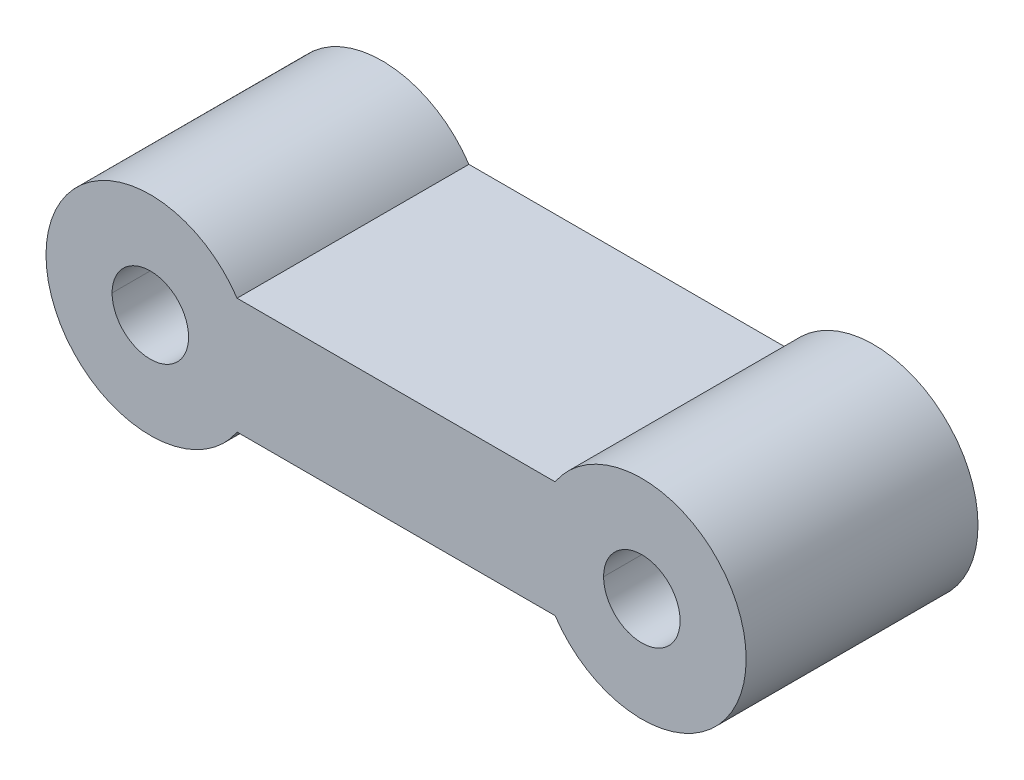
ISO-10303-21;
HEADER;
FILE_DESCRIPTION(('STEP AP214'),'2;1');
FILE_NAME('part.step','',(''),(''),'','','');
FILE_SCHEMA(('AUTOMOTIVE_DESIGN { 1 0 10303 214 1 1 1 1 }'));
ENDSEC;
DATA;
#1=APPLICATION_CONTEXT('core data for automotive mechanical design processes');
#2=APPLICATION_PROTOCOL_DEFINITION('international standard','automotive_design',2000,#1);
#3=PRODUCT_CONTEXT('',#1,'mechanical');
#4=PRODUCT('Part','Part','',(#3));
#5=PRODUCT_RELATED_PRODUCT_CATEGORY('part','',(#4));
#6=PRODUCT_DEFINITION_FORMATION('','',#4);
#7=PRODUCT_DEFINITION_CONTEXT('part definition',#1,'design');
#8=PRODUCT_DEFINITION('design','',#6,#7);
#9=PRODUCT_DEFINITION_SHAPE('','',#8);
#10=(LENGTH_UNIT() NAMED_UNIT(*) SI_UNIT(.MILLI.,.METRE.));
#11=(NAMED_UNIT(*) PLANE_ANGLE_UNIT() SI_UNIT($,.RADIAN.));
#12=(NAMED_UNIT(*) SI_UNIT($,.STERADIAN.) SOLID_ANGLE_UNIT());
#13=UNCERTAINTY_MEASURE_WITH_UNIT(LENGTH_MEASURE(1.E-05),#10,'distance_accuracy_value','');
#14=(GEOMETRIC_REPRESENTATION_CONTEXT(3) GLOBAL_UNCERTAINTY_ASSIGNED_CONTEXT((#13)) GLOBAL_UNIT_ASSIGNED_CONTEXT((#10,
#11,#12)) REPRESENTATION_CONTEXT('',''));
#15=CARTESIAN_POINT('',(0.,0.,0.));
#16=DIRECTION('',(0.,0.,1.));
#17=DIRECTION('',(1.,0.,0.));
#18=AXIS2_PLACEMENT_3D('',#15,#16,#17);
#19=CARTESIAN_POINT('',(10.6,0.,-5.));
#20=DIRECTION('',(0.,0.,1.));
#21=DIRECTION('',(-1.,0.,0.));
#22=AXIS2_PLACEMENT_3D('',#19,#20,#21);
#23=CYLINDRICAL_SURFACE('',#22,1.65);
#24=CARTESIAN_POINT('',(10.6,0.,-5.));
#25=DIRECTION('',(0.,0.,1.));
#26=DIRECTION('',(1.,0.,0.));
#27=AXIS2_PLACEMENT_3D('',#24,#25,#26);
#28=CIRCLE('',#27,1.65);
#29=CARTESIAN_POINT('',(12.25,0.,-5.));
#30=VERTEX_POINT('',#29);
#31=CARTESIAN_POINT('',(8.95,0.,-5.));
#32=VERTEX_POINT('',#31);
#33=EDGE_CURVE('E122',#30,#32,#28,.T.);
#34=ORIENTED_EDGE('',*,*,#33,.F.);
#35=DIRECTION('',(0.,0.,1.));
#36=VECTOR('',#35,1.);
#37=CARTESIAN_POINT('',(12.25,0.,-5.));
#38=LINE('',#37,#36);
#39=CARTESIAN_POINT('',(12.25,0.,5.));
#40=VERTEX_POINT('',#39);
#41=EDGE_CURVE('E41',#30,#40,#38,.T.);
#42=ORIENTED_EDGE('',*,*,#41,.T.);
#43=CARTESIAN_POINT('',(10.6,0.,5.));
#44=DIRECTION('',(0.,0.,1.));
#45=DIRECTION('',(1.,0.,0.));
#46=AXIS2_PLACEMENT_3D('',#43,#44,#45);
#47=CIRCLE('',#46,1.65);
#48=CARTESIAN_POINT('',(8.95,0.,5.));
#49=VERTEX_POINT('',#48);
#50=EDGE_CURVE('E149',#40,#49,#47,.T.);
#51=ORIENTED_EDGE('',*,*,#50,.T.);
#52=DIRECTION('',(0.,0.,1.));
#53=VECTOR('',#52,1.);
#54=CARTESIAN_POINT('',(8.95,0.,-5.));
#55=LINE('',#54,#53);
#56=EDGE_CURVE('E169',#32,#49,#55,.T.);
#57=ORIENTED_EDGE('',*,*,#56,.F.);
#58=EDGE_LOOP('',(#34,#42,#51,#57));
#59=FACE_BOUND('',#58,.T.);
#60=ADVANCED_FACE('F16',(#59),#23,.F.);
#61=CARTESIAN_POINT('',(-10.6,0.,-5.));
#62=DIRECTION('',(0.,0.,1.));
#63=DIRECTION('',(-1.,0.,0.));
#64=AXIS2_PLACEMENT_3D('',#61,#62,#63);
#65=CYLINDRICAL_SURFACE('',#64,1.65);
#66=CARTESIAN_POINT('',(-10.6,0.,-5.));
#67=DIRECTION('',(0.,0.,1.));
#68=DIRECTION('',(1.,0.,0.));
#69=AXIS2_PLACEMENT_3D('',#66,#67,#68);
#70=CIRCLE('',#69,1.65);
#71=CARTESIAN_POINT('',(-8.95,0.,-5.));
#72=VERTEX_POINT('',#71);
#73=CARTESIAN_POINT('',(-12.25,0.,-5.));
#74=VERTEX_POINT('',#73);
#75=EDGE_CURVE('E180',#72,#74,#70,.T.);
#76=ORIENTED_EDGE('',*,*,#75,.F.);
#77=DIRECTION('',(0.,0.,1.));
#78=VECTOR('',#77,1.);
#79=CARTESIAN_POINT('',(-8.95,0.,-5.));
#80=LINE('',#79,#78);
#81=CARTESIAN_POINT('',(-8.95,0.,5.));
#82=VERTEX_POINT('',#81);
#83=EDGE_CURVE('E172',#72,#82,#80,.T.);
#84=ORIENTED_EDGE('',*,*,#83,.T.);
#85=CARTESIAN_POINT('',(-10.6,0.,5.));
#86=DIRECTION('',(0.,0.,1.));
#87=DIRECTION('',(1.,0.,0.));
#88=AXIS2_PLACEMENT_3D('',#85,#86,#87);
#89=CIRCLE('',#88,1.65);
#90=CARTESIAN_POINT('',(-12.25,0.,5.));
#91=VERTEX_POINT('',#90);
#92=EDGE_CURVE('E173',#82,#91,#89,.T.);
#93=ORIENTED_EDGE('',*,*,#92,.T.);
#94=DIRECTION('',(0.,0.,1.));
#95=VECTOR('',#94,1.);
#96=CARTESIAN_POINT('',(-12.25,0.,-5.));
#97=LINE('',#96,#95);
#98=EDGE_CURVE('E575',#74,#91,#97,.T.);
#99=ORIENTED_EDGE('',*,*,#98,.F.);
#100=EDGE_LOOP('',(#76,#84,#93,#99));
#101=FACE_BOUND('',#100,.T.);
#102=ADVANCED_FACE('F308',(#101),#65,.F.);
#103=CARTESIAN_POINT('',(-10.6,0.,-5.));
#104=DIRECTION('',(0.,0.,1.));
#105=DIRECTION('',(-1.,0.,0.));
#106=AXIS2_PLACEMENT_3D('',#103,#104,#105);
#107=CYLINDRICAL_SURFACE('',#106,4.5);
#108=CARTESIAN_POINT('',(-10.6,0.,-5.));
#109=DIRECTION('',(0.,0.,1.));
#110=DIRECTION('',(1.,0.,0.));
#111=AXIS2_PLACEMENT_3D('',#108,#109,#110);
#112=CIRCLE('',#111,4.5);
#113=CARTESIAN_POINT('',(-6.85834261322606,2.5,-5.));
#114=VERTEX_POINT('',#113);
#115=CARTESIAN_POINT('',(-15.1,0.,-5.));
#116=VERTEX_POINT('',#115);
#117=EDGE_CURVE('E152',#114,#116,#112,.T.);
#118=ORIENTED_EDGE('',*,*,#117,.T.);
#119=DIRECTION('',(0.,0.,1.));
#120=VECTOR('',#119,1.);
#121=CARTESIAN_POINT('',(-15.1,0.,-5.));
#122=LINE('',#121,#120);
#123=CARTESIAN_POINT('',(-15.1,0.,5.));
#124=VERTEX_POINT('',#123);
#125=EDGE_CURVE('E11',#116,#124,#122,.T.);
#126=ORIENTED_EDGE('',*,*,#125,.T.);
#127=CARTESIAN_POINT('',(-10.6,0.,5.));
#128=DIRECTION('',(0.,0.,1.));
#129=DIRECTION('',(1.,0.,0.));
#130=AXIS2_PLACEMENT_3D('',#127,#128,#129);
#131=CIRCLE('',#130,4.5);
#132=CARTESIAN_POINT('',(-6.85834261322606,2.5,5.));
#133=VERTEX_POINT('',#132);
#134=EDGE_CURVE('E157',#133,#124,#131,.T.);
#135=ORIENTED_EDGE('',*,*,#134,.F.);
#136=DIRECTION('',(0.,0.,1.));
#137=VECTOR('',#136,1.);
#138=CARTESIAN_POINT('',(-6.85834261322606,2.5,-5.));
#139=LINE('',#138,#137);
#140=EDGE_CURVE('E121',#114,#133,#139,.T.);
#141=ORIENTED_EDGE('',*,*,#140,.F.);
#142=EDGE_LOOP('',(#118,#126,#135,#141));
#143=FACE_BOUND('',#142,.T.);
#144=ADVANCED_FACE('F312',(#143),#107,.T.);
#145=CARTESIAN_POINT('',(-10.6,0.,-5.));
#146=DIRECTION('',(0.,0.,1.));
#147=DIRECTION('',(-1.,0.,0.));
#148=AXIS2_PLACEMENT_3D('',#145,#146,#147);
#149=CYLINDRICAL_SURFACE('',#148,4.5);
#150=ORIENTED_EDGE('',*,*,#125,.F.);
#151=CARTESIAN_POINT('',(-10.6,0.,-5.));
#152=DIRECTION('',(0.,0.,1.));
#153=DIRECTION('',(1.,0.,0.));
#154=AXIS2_PLACEMENT_3D('',#151,#152,#153);
#155=CIRCLE('',#154,4.5);
#156=CARTESIAN_POINT('',(-6.85834261322606,-2.5,-5.));
#157=VERTEX_POINT('',#156);
#158=EDGE_CURVE('E167',#116,#157,#155,.T.);
#159=ORIENTED_EDGE('',*,*,#158,.T.);
#160=DIRECTION('',(0.,0.,1.));
#161=VECTOR('',#160,1.);
#162=CARTESIAN_POINT('',(-6.85834261322606,-2.5,-5.));
#163=LINE('',#162,#161);
#164=CARTESIAN_POINT('',(-6.85834261322606,-2.5,5.));
#165=VERTEX_POINT('',#164);
#166=EDGE_CURVE('E27',#157,#165,#163,.T.);
#167=ORIENTED_EDGE('',*,*,#166,.T.);
#168=CARTESIAN_POINT('',(-10.6,0.,5.));
#169=DIRECTION('',(0.,0.,1.));
#170=DIRECTION('',(1.,0.,0.));
#171=AXIS2_PLACEMENT_3D('',#168,#169,#170);
#172=CIRCLE('',#171,4.5);
#173=EDGE_CURVE('E144',#124,#165,#172,.T.);
#174=ORIENTED_EDGE('',*,*,#173,.F.);
#175=EDGE_LOOP('',(#150,#159,#167,#174));
#176=FACE_BOUND('',#175,.T.);
#177=ADVANCED_FACE('F318',(#176),#149,.T.);
#178=CARTESIAN_POINT('',(0.,-2.5,-5.));
#179=DIRECTION('',(0.,1.,0.));
#180=DIRECTION('',(1.,0.,0.));
#181=AXIS2_PLACEMENT_3D('',#178,#179,#180);
#182=PLANE('',#181);
#183=DIRECTION('',(1.,0.,0.));
#184=VECTOR('',#183,1.);
#185=CARTESIAN_POINT('',(0.,-2.5,5.));
#186=LINE('',#185,#184);
#187=CARTESIAN_POINT('',(6.85834261322606,-2.5,5.));
#188=VERTEX_POINT('',#187);
#189=EDGE_CURVE('E136',#165,#188,#186,.T.);
#190=ORIENTED_EDGE('',*,*,#189,.F.);
#191=ORIENTED_EDGE('',*,*,#166,.F.);
#192=DIRECTION('',(1.,0.,0.));
#193=VECTOR('',#192,1.);
#194=CARTESIAN_POINT('',(0.,-2.5,-5.));
#195=LINE('',#194,#193);
#196=CARTESIAN_POINT('',(6.85834261322606,-2.5,-5.));
#197=VERTEX_POINT('',#196);
#198=EDGE_CURVE('E164',#157,#197,#195,.T.);
#199=ORIENTED_EDGE('',*,*,#198,.T.);
#200=DIRECTION('',(0.,0.,1.));
#201=VECTOR('',#200,1.);
#202=CARTESIAN_POINT('',(6.85834261322606,-2.5,-5.));
#203=LINE('',#202,#201);
#204=EDGE_CURVE('E187',#197,#188,#203,.T.);
#205=ORIENTED_EDGE('',*,*,#204,.T.);
#206=EDGE_LOOP('',(#190,#191,#199,#205));
#207=FACE_BOUND('',#206,.T.);
#208=ADVANCED_FACE('F322',(#207),#182,.F.);
#209=CARTESIAN_POINT('',(10.6,0.,-5.));
#210=DIRECTION('',(0.,0.,1.));
#211=DIRECTION('',(-1.,0.,0.));
#212=AXIS2_PLACEMENT_3D('',#209,#210,#211);
#213=CYLINDRICAL_SURFACE('',#212,4.5);
#214=CARTESIAN_POINT('',(10.6,0.,5.));
#215=DIRECTION('',(0.,0.,1.));
#216=DIRECTION('',(1.,0.,0.));
#217=AXIS2_PLACEMENT_3D('',#214,#215,#216);
#218=CIRCLE('',#217,4.5);
#219=CARTESIAN_POINT('',(6.85834261322606,2.5,5.));
#220=VERTEX_POINT('',#219);
#221=EDGE_CURVE('E113',#188,#220,#218,.T.);
#222=ORIENTED_EDGE('',*,*,#221,.F.);
#223=ORIENTED_EDGE('',*,*,#204,.F.);
#224=CARTESIAN_POINT('',(10.6,0.,-5.));
#225=DIRECTION('',(0.,0.,1.));
#226=DIRECTION('',(1.,0.,0.));
#227=AXIS2_PLACEMENT_3D('',#224,#225,#226);
#228=CIRCLE('',#227,4.5);
#229=CARTESIAN_POINT('',(6.85834261322606,2.5,-5.));
#230=VERTEX_POINT('',#229);
#231=EDGE_CURVE('E116',#197,#230,#228,.T.);
#232=ORIENTED_EDGE('',*,*,#231,.T.);
#233=DIRECTION('',(0.,0.,1.));
#234=VECTOR('',#233,1.);
#235=CARTESIAN_POINT('',(6.85834261322606,2.5,-5.));
#236=LINE('',#235,#234);
#237=EDGE_CURVE('E110',#230,#220,#236,.T.);
#238=ORIENTED_EDGE('',*,*,#237,.T.);
#239=EDGE_LOOP('',(#222,#223,#232,#238));
#240=FACE_BOUND('',#239,.T.);
#241=ADVANCED_FACE('F18',(#240),#213,.T.);
#242=CARTESIAN_POINT('',(-10.6,0.,-5.));
#243=DIRECTION('',(0.,0.,1.));
#244=DIRECTION('',(-1.,0.,0.));
#245=AXIS2_PLACEMENT_3D('',#242,#243,#244);
#246=CYLINDRICAL_SURFACE('',#245,1.65);
#247=ORIENTED_EDGE('',*,*,#83,.F.);
#248=CARTESIAN_POINT('',(-10.6,0.,-5.));
#249=DIRECTION('',(0.,0.,1.));
#250=DIRECTION('',(1.,0.,0.));
#251=AXIS2_PLACEMENT_3D('',#248,#249,#250);
#252=CIRCLE('',#251,1.65);
#253=EDGE_CURVE('E20',#74,#72,#252,.T.);
#254=ORIENTED_EDGE('',*,*,#253,.F.);
#255=ORIENTED_EDGE('',*,*,#98,.T.);
#256=CARTESIAN_POINT('',(-10.6,0.,5.));
#257=DIRECTION('',(0.,0.,1.));
#258=DIRECTION('',(1.,0.,0.));
#259=AXIS2_PLACEMENT_3D('',#256,#257,#258);
#260=CIRCLE('',#259,1.65);
#261=EDGE_CURVE('E131',#91,#82,#260,.T.);
#262=ORIENTED_EDGE('',*,*,#261,.T.);
#263=EDGE_LOOP('',(#247,#254,#255,#262));
#264=FACE_BOUND('',#263,.T.);
#265=ADVANCED_FACE('F380',(#264),#246,.F.);
#266=CARTESIAN_POINT('',(10.6,0.,-5.));
#267=DIRECTION('',(0.,0.,1.));
#268=DIRECTION('',(-1.,0.,0.));
#269=AXIS2_PLACEMENT_3D('',#266,#267,#268);
#270=CYLINDRICAL_SURFACE('',#269,1.65);
#271=ORIENTED_EDGE('',*,*,#41,.F.);
#272=CARTESIAN_POINT('',(10.6,0.,-5.));
#273=DIRECTION('',(0.,0.,1.));
#274=DIRECTION('',(1.,0.,0.));
#275=AXIS2_PLACEMENT_3D('',#272,#273,#274);
#276=CIRCLE('',#275,1.65);
#277=EDGE_CURVE('E176',#32,#30,#276,.T.);
#278=ORIENTED_EDGE('',*,*,#277,.F.);
#279=ORIENTED_EDGE('',*,*,#56,.T.);
#280=CARTESIAN_POINT('',(10.6,0.,5.));
#281=DIRECTION('',(0.,0.,1.));
#282=DIRECTION('',(1.,0.,0.));
#283=AXIS2_PLACEMENT_3D('',#280,#281,#282);
#284=CIRCLE('',#283,1.65);
#285=EDGE_CURVE('E153',#49,#40,#284,.T.);
#286=ORIENTED_EDGE('',*,*,#285,.T.);
#287=EDGE_LOOP('',(#271,#278,#279,#286));
#288=FACE_BOUND('',#287,.T.);
#289=ADVANCED_FACE('F364',(#288),#270,.F.);
#290=CARTESIAN_POINT('',(0.,2.5,-5.));
#291=DIRECTION('',(0.,1.,0.));
#292=DIRECTION('',(1.,0.,0.));
#293=AXIS2_PLACEMENT_3D('',#290,#291,#292);
#294=PLANE('',#293);
#295=DIRECTION('',(1.,0.,0.));
#296=VECTOR('',#295,1.);
#297=CARTESIAN_POINT('',(0.,2.5,5.));
#298=LINE('',#297,#296);
#299=EDGE_CURVE('E125',#133,#220,#298,.T.);
#300=ORIENTED_EDGE('',*,*,#299,.T.);
#301=ORIENTED_EDGE('',*,*,#237,.F.);
#302=DIRECTION('',(1.,0.,0.));
#303=VECTOR('',#302,1.);
#304=CARTESIAN_POINT('',(0.,2.5,-5.));
#305=LINE('',#304,#303);
#306=EDGE_CURVE('E158',#114,#230,#305,.T.);
#307=ORIENTED_EDGE('',*,*,#306,.F.);
#308=ORIENTED_EDGE('',*,*,#140,.T.);
#309=EDGE_LOOP('',(#300,#301,#307,#308));
#310=FACE_BOUND('',#309,.T.);
#311=ADVANCED_FACE('F126',(#310),#294,.T.);
#312=CARTESIAN_POINT('',(0.,0.,-5.));
#313=DIRECTION('',(0.,0.,-1.));
#314=DIRECTION('',(0.,-1.,0.));
#315=AXIS2_PLACEMENT_3D('',#312,#313,#314);
#316=PLANE('',#315);
#317=ORIENTED_EDGE('',*,*,#277,.T.);
#318=ORIENTED_EDGE('',*,*,#33,.T.);
#319=EDGE_LOOP('',(#317,#318));
#320=FACE_BOUND('',#319,.T.);
#321=ORIENTED_EDGE('',*,*,#253,.T.);
#322=ORIENTED_EDGE('',*,*,#75,.T.);
#323=EDGE_LOOP('',(#321,#322));
#324=FACE_BOUND('',#323,.T.);
#325=ORIENTED_EDGE('',*,*,#117,.F.);
#326=ORIENTED_EDGE('',*,*,#306,.T.);
#327=ORIENTED_EDGE('',*,*,#231,.F.);
#328=ORIENTED_EDGE('',*,*,#198,.F.);
#329=ORIENTED_EDGE('',*,*,#158,.F.);
#330=EDGE_LOOP('',(#325,#326,#327,#328,#329));
#331=FACE_BOUND('',#330,.T.);
#332=ADVANCED_FACE('F347',(#320,#324,#331),#316,.T.);
#333=CARTESIAN_POINT('',(0.,0.,5.));
#334=DIRECTION('',(0.,0.,-1.));
#335=DIRECTION('',(0.,-1.,0.));
#336=AXIS2_PLACEMENT_3D('',#333,#334,#335);
#337=PLANE('',#336);
#338=ORIENTED_EDGE('',*,*,#285,.F.);
#339=ORIENTED_EDGE('',*,*,#50,.F.);
#340=EDGE_LOOP('',(#338,#339));
#341=FACE_BOUND('',#340,.T.);
#342=ORIENTED_EDGE('',*,*,#261,.F.);
#343=ORIENTED_EDGE('',*,*,#92,.F.);
#344=EDGE_LOOP('',(#342,#343));
#345=FACE_BOUND('',#344,.T.);
#346=ORIENTED_EDGE('',*,*,#134,.T.);
#347=ORIENTED_EDGE('',*,*,#173,.T.);
#348=ORIENTED_EDGE('',*,*,#189,.T.);
#349=ORIENTED_EDGE('',*,*,#221,.T.);
#350=ORIENTED_EDGE('',*,*,#299,.F.);
#351=EDGE_LOOP('',(#346,#347,#348,#349,#350));
#352=FACE_BOUND('',#351,.T.);
#353=ADVANCED_FACE('F133',(#341,#345,#352),#337,.F.);
#354=CLOSED_SHELL('',(#60,#102,#144,#177,#208,#241,#265,#289,#311,#332,#353));
#355=MANIFOLD_SOLID_BREP('B1',#354);
#356=ADVANCED_BREP_SHAPE_REPRESENTATION('',(#18,#355),#14);
#357=SHAPE_DEFINITION_REPRESENTATION(#9,#356);
ENDSEC;
END-ISO-10303-21;
